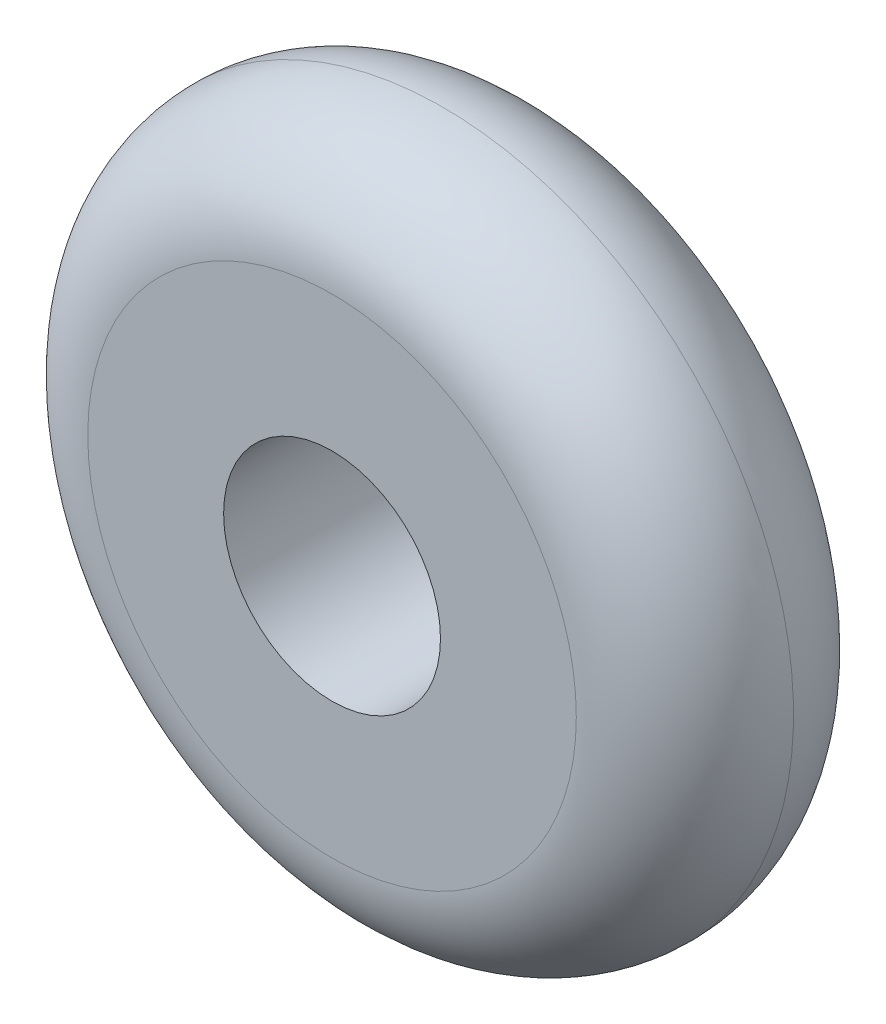
ISO-10303-21;
HEADER;
FILE_DESCRIPTION(('STEP AP214'),'2;1');
FILE_NAME('part.step','',(''),(''),'','','');
FILE_SCHEMA(('AUTOMOTIVE_DESIGN { 1 0 10303 214 1 1 1 1 }'));
ENDSEC;
DATA;
#1=APPLICATION_CONTEXT('core data for automotive mechanical design processes');
#2=APPLICATION_PROTOCOL_DEFINITION('international standard','automotive_design',2000,#1);
#3=PRODUCT_CONTEXT('',#1,'mechanical');
#4=PRODUCT('Part','Part','',(#3));
#5=PRODUCT_RELATED_PRODUCT_CATEGORY('part','',(#4));
#6=PRODUCT_DEFINITION_FORMATION('','',#4);
#7=PRODUCT_DEFINITION_CONTEXT('part definition',#1,'design');
#8=PRODUCT_DEFINITION('design','',#6,#7);
#9=PRODUCT_DEFINITION_SHAPE('','',#8);
#10=(LENGTH_UNIT() NAMED_UNIT(*) SI_UNIT(.MILLI.,.METRE.));
#11=(NAMED_UNIT(*) PLANE_ANGLE_UNIT() SI_UNIT($,.RADIAN.));
#12=(NAMED_UNIT(*) SI_UNIT($,.STERADIAN.) SOLID_ANGLE_UNIT());
#13=UNCERTAINTY_MEASURE_WITH_UNIT(LENGTH_MEASURE(1.E-05),#10,'distance_accuracy_value','');
#14=(GEOMETRIC_REPRESENTATION_CONTEXT(3) GLOBAL_UNCERTAINTY_ASSIGNED_CONTEXT((#13)) GLOBAL_UNIT_ASSIGNED_CONTEXT((#10,
#11,#12)) REPRESENTATION_CONTEXT('',''));
#15=CARTESIAN_POINT('',(0.,0.,0.));
#16=DIRECTION('',(0.,0.,1.));
#17=DIRECTION('',(1.,0.,0.));
#18=AXIS2_PLACEMENT_3D('',#15,#16,#17);
#19=CARTESIAN_POINT('',(0.,0.,0.));
#20=DIRECTION('',(0.,0.,1.));
#21=DIRECTION('',(1.,0.,0.));
#22=AXIS2_PLACEMENT_3D('',#19,#20,#21);
#23=PLANE('',#22);
#24=CARTESIAN_POINT('',(0.,0.,0.));
#25=DIRECTION('',(0.,0.,1.));
#26=DIRECTION('',(1.,0.,0.));
#27=AXIS2_PLACEMENT_3D('',#24,#25,#26);
#28=CIRCLE('',#27,10.75);
#29=CARTESIAN_POINT('',(10.75,0.,0.));
#30=VERTEX_POINT('',#29);
#31=EDGE_CURVE('E36',#30,#30,#28,.T.);
#32=ORIENTED_EDGE('',*,*,#31,.T.);
#33=EDGE_LOOP('',(#32));
#34=FACE_BOUND('',#33,.T.);
#35=CARTESIAN_POINT('',(0.,0.,0.));
#36=DIRECTION('',(0.,0.,-1.));
#37=DIRECTION('',(-1.,0.,0.));
#38=AXIS2_PLACEMENT_3D('',#35,#36,#37);
#39=CIRCLE('',#38,24.2164032007572);
#40=CARTESIAN_POINT('',(-24.2164032007572,0.,0.));
#41=VERTEX_POINT('',#40);
#42=EDGE_CURVE('E79',#41,#41,#39,.T.);
#43=ORIENTED_EDGE('',*,*,#42,.T.);
#44=EDGE_LOOP('',(#43));
#45=FACE_BOUND('',#44,.T.);
#46=ADVANCED_FACE('F33',(#34,#45),#23,.F.);
#47=CARTESIAN_POINT('',(0.,0.,22.));
#48=DIRECTION('',(0.,0.,1.));
#49=DIRECTION('',(1.,0.,0.));
#50=AXIS2_PLACEMENT_3D('',#47,#48,#49);
#51=PLANE('',#50);
#52=CARTESIAN_POINT('',(0.,0.,22.));
#53=DIRECTION('',(0.,0.,1.));
#54=DIRECTION('',(1.,0.,0.));
#55=AXIS2_PLACEMENT_3D('',#52,#53,#54);
#56=CIRCLE('',#55,10.75);
#57=CARTESIAN_POINT('',(10.75,0.,22.));
#58=VERTEX_POINT('',#57);
#59=EDGE_CURVE('E10',#58,#58,#56,.T.);
#60=ORIENTED_EDGE('',*,*,#59,.F.);
#61=EDGE_LOOP('',(#60));
#62=FACE_BOUND('',#61,.T.);
#63=CARTESIAN_POINT('',(0.,0.,22.));
#64=DIRECTION('',(0.,0.,-1.));
#65=DIRECTION('',(-1.,0.,0.));
#66=AXIS2_PLACEMENT_3D('',#63,#64,#65);
#67=CIRCLE('',#66,24.2164032007568);
#68=CARTESIAN_POINT('',(-24.2164032007568,0.,22.));
#69=VERTEX_POINT('',#68);
#70=EDGE_CURVE('E43',#69,#69,#67,.T.);
#71=ORIENTED_EDGE('',*,*,#70,.F.);
#72=EDGE_LOOP('',(#71));
#73=FACE_BOUND('',#72,.T.);
#74=ADVANCED_FACE('F66',(#62,#73),#51,.T.);
#75=CARTESIAN_POINT('',(0.,0.,22.));
#76=DIRECTION('',(0.,0.,-1.));
#77=DIRECTION('',(-1.,0.,0.));
#78=AXIS2_PLACEMENT_3D('',#75,#76,#77);
#79=CYLINDRICAL_SURFACE('',#78,10.75);
#80=ORIENTED_EDGE('',*,*,#59,.T.);
#81=EDGE_LOOP('',(#80));
#82=FACE_BOUND('',#81,.T.);
#83=ORIENTED_EDGE('',*,*,#31,.F.);
#84=EDGE_LOOP('',(#83));
#85=FACE_BOUND('',#84,.T.);
#86=ADVANCED_FACE('F62',(#82,#85),#79,.F.);
#87=CARTESIAN_POINT('',(34.7500009787852,0.,11.));
#88=CARTESIAN_POINT('',(34.7500009787852,0.,16.9631253855027));
#89=CARTESIAN_POINT('',(29.8422654091905,0.,22.0291687815467));
#90=CARTESIAN_POINT('',(24.1180210952802,0.,22.));
#91=B_SPLINE_CURVE_WITH_KNOTS('',3,(#87,#88,#89,#90),.UNSPECIFIED.,.F.,.F.,(4,4),(0.,1.),.UNSPECIFIED.);
#92=CARTESIAN_POINT('',(0.,0.,0.));
#93=DIRECTION('',(0.,0.,-1.));
#94=AXIS1_PLACEMENT('',#92,#93);
#95=SURFACE_OF_REVOLUTION('',#91,#94);
#96=ORIENTED_EDGE('',*,*,#70,.T.);
#97=EDGE_LOOP('',(#96));
#98=FACE_BOUND('',#97,.T.);
#99=CARTESIAN_POINT('',(0.,0.,11.));
#100=DIRECTION('',(0.,0.,-1.));
#101=DIRECTION('',(-1.,0.,0.));
#102=AXIS2_PLACEMENT_3D('',#99,#100,#101);
#103=CIRCLE('',#102,34.7500009787852);
#104=CARTESIAN_POINT('',(-34.7500009787852,0.,11.));
#105=VERTEX_POINT('',#104);
#106=EDGE_CURVE('E47',#105,#105,#103,.T.);
#107=ORIENTED_EDGE('',*,*,#106,.F.);
#108=EDGE_LOOP('',(#107));
#109=FACE_BOUND('',#108,.T.);
#110=ADVANCED_FACE('F57',(#98,#109),#95,.F.);
#111=CARTESIAN_POINT('',(34.7500009787852,0.,11.));
#112=CARTESIAN_POINT('',(34.7500009787852,0.,5.03687461449735));
#113=CARTESIAN_POINT('',(29.8422654091905,0.,-0.0291687815466604));
#114=CARTESIAN_POINT('',(24.1180210952802,0.,0.));
#115=B_SPLINE_CURVE_WITH_KNOTS('',3,(#111,#112,#113,#114),.UNSPECIFIED.,.F.,.F.,(4,4),(0.,1.),.UNSPECIFIED.);
#116=CARTESIAN_POINT('',(0.,0.,0.));
#117=DIRECTION('',(0.,0.,-1.));
#118=AXIS1_PLACEMENT('',#116,#117);
#119=SURFACE_OF_REVOLUTION('',#115,#118);
#120=ORIENTED_EDGE('',*,*,#42,.F.);
#121=EDGE_LOOP('',(#120));
#122=FACE_BOUND('',#121,.T.);
#123=ORIENTED_EDGE('',*,*,#106,.T.);
#124=EDGE_LOOP('',(#123));
#125=FACE_BOUND('',#124,.T.);
#126=ADVANCED_FACE('F61',(#122,#125),#119,.T.);
#127=CLOSED_SHELL('',(#46,#74,#86,#110,#126));
#128=MANIFOLD_SOLID_BREP('B2',#127);
#129=ADVANCED_BREP_SHAPE_REPRESENTATION('',(#18,#128),#14);
#130=SHAPE_DEFINITION_REPRESENTATION(#9,#129);
ENDSEC;
END-ISO-10303-21;
